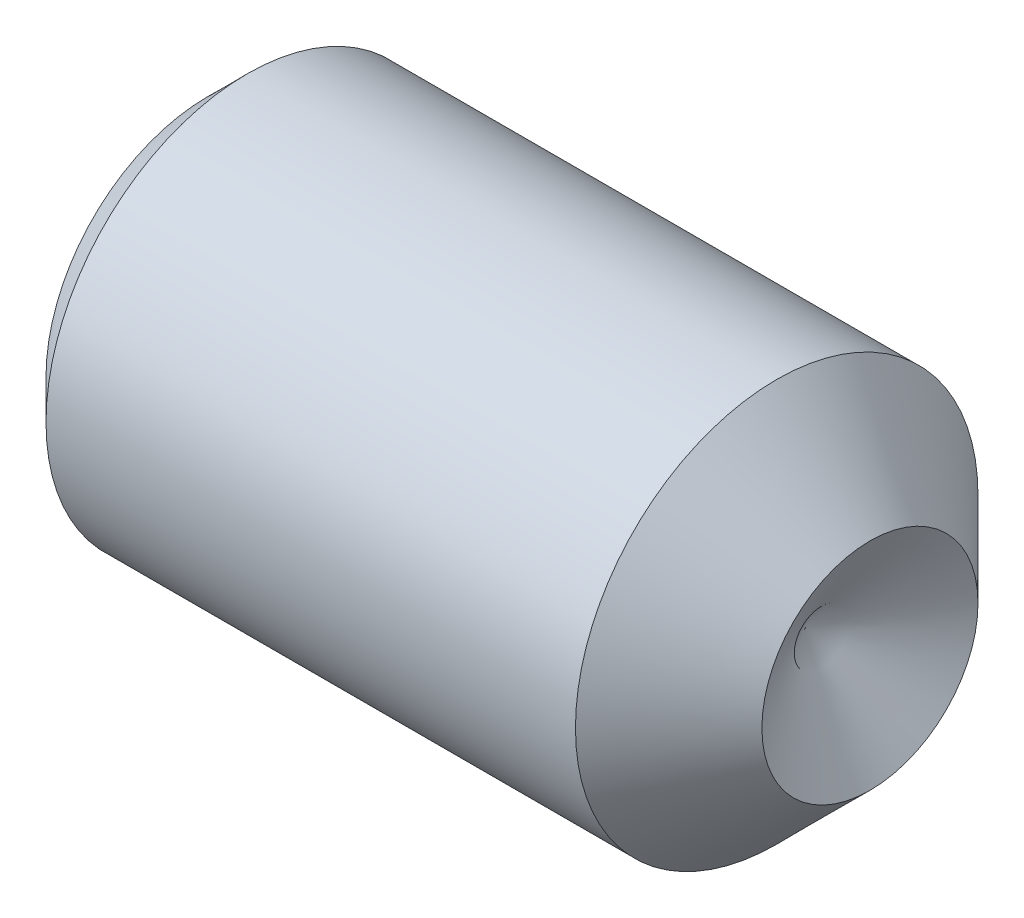
ISO-10303-21;
HEADER;
FILE_DESCRIPTION(('STEP AP214'),'2;1');
FILE_NAME('part.step','',(''),(''),'','','');
FILE_SCHEMA(('AUTOMOTIVE_DESIGN { 1 0 10303 214 1 1 1 1 }'));
ENDSEC;
DATA;
#1=APPLICATION_CONTEXT('core data for automotive mechanical design processes');
#2=APPLICATION_PROTOCOL_DEFINITION('international standard','automotive_design',2000,#1);
#3=PRODUCT_CONTEXT('',#1,'mechanical');
#4=PRODUCT('Part','Part','',(#3));
#5=PRODUCT_RELATED_PRODUCT_CATEGORY('part','',(#4));
#6=PRODUCT_DEFINITION_FORMATION('','',#4);
#7=PRODUCT_DEFINITION_CONTEXT('part definition',#1,'design');
#8=PRODUCT_DEFINITION('design','',#6,#7);
#9=PRODUCT_DEFINITION_SHAPE('','',#8);
#10=(LENGTH_UNIT() NAMED_UNIT(*) SI_UNIT(.MILLI.,.METRE.));
#11=(NAMED_UNIT(*) PLANE_ANGLE_UNIT() SI_UNIT($,.RADIAN.));
#12=(NAMED_UNIT(*) SI_UNIT($,.STERADIAN.) SOLID_ANGLE_UNIT());
#13=UNCERTAINTY_MEASURE_WITH_UNIT(LENGTH_MEASURE(1.E-05),#10,'distance_accuracy_value','');
#14=(GEOMETRIC_REPRESENTATION_CONTEXT(3) GLOBAL_UNCERTAINTY_ASSIGNED_CONTEXT((#13)) GLOBAL_UNIT_ASSIGNED_CONTEXT((#10,
#11,#12)) REPRESENTATION_CONTEXT('',''));
#15=CARTESIAN_POINT('',(0.,0.,0.));
#16=DIRECTION('',(0.,0.,1.));
#17=DIRECTION('',(1.,0.,0.));
#18=AXIS2_PLACEMENT_3D('',#15,#16,#17);
#19=CARTESIAN_POINT('',(0.,0.,0.));
#20=DIRECTION('',(-1.,0.,0.));
#21=DIRECTION('',(0.,0.,1.));
#22=AXIS2_PLACEMENT_3D('',#19,#20,#21);
#23=PLANE('',#22);
#24=CARTESIAN_POINT('',(0.,0.,0.));
#25=DIRECTION('',(-1.,0.,0.));
#26=DIRECTION('',(0.,0.,1.));
#27=AXIS2_PLACEMENT_3D('',#24,#25,#26);
#28=CIRCLE('',#27,1.94056);
#29=CARTESIAN_POINT('',(0.,0.,1.94056));
#30=VERTEX_POINT('',#29);
#31=EDGE_CURVE('E11',#30,#30,#28,.T.);
#32=ORIENTED_EDGE('',*,*,#31,.T.);
#33=EDGE_LOOP('',(#32));
#34=FACE_BOUND('',#33,.T.);
#35=DIRECTION('',(0.,0.,-1.));
#36=VECTOR('',#35,1.);
#37=CARTESIAN_POINT('',(0.,1.18999,0.687041046832963));
#38=LINE('',#37,#36);
#39=CARTESIAN_POINT('',(0.,1.18999,0.687041046832963));
#40=VERTEX_POINT('',#39);
#41=CARTESIAN_POINT('',(0.,1.18999,-0.687041046832962));
#42=VERTEX_POINT('',#41);
#43=EDGE_CURVE('E95',#40,#42,#38,.T.);
#44=ORIENTED_EDGE('',*,*,#43,.F.);
#45=DIRECTION('',(0.,-0.866025403784438,0.5));
#46=VECTOR('',#45,1.);
#47=CARTESIAN_POINT('',(0.,1.18999,0.687041046832963));
#48=LINE('',#47,#46);
#49=CARTESIAN_POINT('',(0.,0.,1.37408209366593));
#50=VERTEX_POINT('',#49);
#51=EDGE_CURVE('E48',#40,#50,#48,.T.);
#52=ORIENTED_EDGE('',*,*,#51,.T.);
#53=DIRECTION('',(0.,0.866025403784439,0.5));
#54=VECTOR('',#53,1.);
#55=CARTESIAN_POINT('',(0.,-1.18999,0.687041046832963));
#56=LINE('',#55,#54);
#57=CARTESIAN_POINT('',(0.,-1.18999,0.687041046832963));
#58=VERTEX_POINT('',#57);
#59=EDGE_CURVE('E101',#58,#50,#56,.T.);
#60=ORIENTED_EDGE('',*,*,#59,.F.);
#61=DIRECTION('',(0.,0.,-1.));
#62=VECTOR('',#61,1.);
#63=CARTESIAN_POINT('',(0.,-1.18999,0.687041046832963));
#64=LINE('',#63,#62);
#65=CARTESIAN_POINT('',(0.,-1.18999,-0.687041046832962));
#66=VERTEX_POINT('',#65);
#67=EDGE_CURVE('E121',#58,#66,#64,.T.);
#68=ORIENTED_EDGE('',*,*,#67,.T.);
#69=DIRECTION('',(0.,0.866025403784438,-0.5));
#70=VECTOR('',#69,1.);
#71=CARTESIAN_POINT('',(0.,-1.18999,-0.687041046832962));
#72=LINE('',#71,#70);
#73=CARTESIAN_POINT('',(0.,0.,-1.37408209366593));
#74=VERTEX_POINT('',#73);
#75=EDGE_CURVE('E124',#66,#74,#72,.T.);
#76=ORIENTED_EDGE('',*,*,#75,.T.);
#77=DIRECTION('',(0.,-0.866025403784438,-0.5));
#78=VECTOR('',#77,1.);
#79=CARTESIAN_POINT('',(0.,1.18999,-0.687041046832962));
#80=LINE('',#79,#78);
#81=EDGE_CURVE('E127',#42,#74,#80,.T.);
#82=ORIENTED_EDGE('',*,*,#81,.F.);
#83=EDGE_LOOP('',(#44,#52,#60,#68,#76,#82));
#84=FACE_BOUND('',#83,.T.);
#85=ADVANCED_FACE('F34',(#34,#84),#23,.T.);
#86=CARTESIAN_POINT('',(0.,0.,0.));
#87=DIRECTION('',(1.,0.,0.));
#88=DIRECTION('',(0.,0.,-1.));
#89=AXIS2_PLACEMENT_3D('',#86,#87,#88);
#90=CONICAL_SURFACE('',#89,1.94056,0.785398163397452);
#91=CARTESIAN_POINT('',(0.472439999999998,0.,0.));
#92=DIRECTION('',(-1.,0.,0.));
#93=DIRECTION('',(0.,0.,1.));
#94=AXIS2_PLACEMENT_3D('',#91,#92,#93);
#95=CIRCLE('',#94,2.413);
#96=CARTESIAN_POINT('',(0.472439999999998,0.,2.413));
#97=VERTEX_POINT('',#96);
#98=EDGE_CURVE('E41',#97,#97,#95,.T.);
#99=ORIENTED_EDGE('',*,*,#98,.T.);
#100=EDGE_LOOP('',(#99));
#101=FACE_BOUND('',#100,.T.);
#102=ORIENTED_EDGE('',*,*,#31,.F.);
#103=EDGE_LOOP('',(#102));
#104=FACE_BOUND('',#103,.T.);
#105=ADVANCED_FACE('F147',(#101,#104),#90,.T.);
#106=CARTESIAN_POINT('',(-12.7,0.,0.));
#107=DIRECTION('',(-1.,0.,0.));
#108=DIRECTION('',(0.,0.,1.));
#109=AXIS2_PLACEMENT_3D('',#106,#107,#108);
#110=CYLINDRICAL_SURFACE('',#109,2.413);
#111=CARTESIAN_POINT('',(6.81990000000001,0.,0.));
#112=DIRECTION('',(-1.,0.,0.));
#113=DIRECTION('',(0.,0.,1.));
#114=AXIS2_PLACEMENT_3D('',#111,#112,#113);
#115=CIRCLE('',#114,2.413);
#116=CARTESIAN_POINT('',(6.81990000000001,0.,2.413));
#117=VERTEX_POINT('',#116);
#118=EDGE_CURVE('E142',#117,#117,#115,.T.);
#119=ORIENTED_EDGE('',*,*,#118,.T.);
#120=EDGE_LOOP('',(#119));
#121=FACE_BOUND('',#120,.T.);
#122=ORIENTED_EDGE('',*,*,#98,.F.);
#123=EDGE_LOOP('',(#122));
#124=FACE_BOUND('',#123,.T.);
#125=ADVANCED_FACE('F150',(#121,#124),#110,.T.);
#126=CARTESIAN_POINT('',(6.81990000000001,0.,0.));
#127=DIRECTION('',(-1.,0.,0.));
#128=DIRECTION('',(0.,0.,1.));
#129=AXIS2_PLACEMENT_3D('',#126,#127,#128);
#130=CONICAL_SURFACE('',#129,2.413,0.785398163397454);
#131=CARTESIAN_POINT('',(7.9375,0.,0.));
#132=DIRECTION('',(-1.,0.,0.));
#133=DIRECTION('',(0.,0.,1.));
#134=AXIS2_PLACEMENT_3D('',#131,#132,#133);
#135=CIRCLE('',#134,1.2954);
#136=CARTESIAN_POINT('',(7.9375,0.,1.2954));
#137=VERTEX_POINT('',#136);
#138=EDGE_CURVE('E102',#137,#137,#135,.T.);
#139=ORIENTED_EDGE('',*,*,#138,.T.);
#140=EDGE_LOOP('',(#139));
#141=FACE_BOUND('',#140,.T.);
#142=ORIENTED_EDGE('',*,*,#118,.F.);
#143=EDGE_LOOP('',(#142));
#144=FACE_BOUND('',#143,.T.);
#145=ADVANCED_FACE('F152',(#141,#144),#130,.T.);
#146=CARTESIAN_POINT('',(7.1591451541117,0.,0.));
#147=DIRECTION('',(1.,0.,0.));
#148=DIRECTION('',(0.,0.,-1.));
#149=AXIS2_PLACEMENT_3D('',#146,#147,#148);
#150=CONICAL_SURFACE('',#149,0.,1.02974425867666);
#151=ORIENTED_EDGE('',*,*,#138,.F.);
#152=EDGE_LOOP('',(#151));
#153=FACE_BOUND('',#152,.T.);
#154=CARTESIAN_POINT('',(7.1591451541117,0.,0.));
#155=VERTEX_POINT('',#154);
#156=VERTEX_LOOP('',#155);
#157=FACE_BOUND('',#156,.T.);
#158=ADVANCED_FACE('F159',(#153,#157),#150,.F.);
#159=CARTESIAN_POINT('',(2.54,1.18999,0.687041046832963));
#160=DIRECTION('',(0.,-0.5,-0.866025403784439));
#161=DIRECTION('',(0.,0.866025403784438,-0.5));
#162=AXIS2_PLACEMENT_3D('',#159,#160,#161);
#163=PLANE('',#162);
#164=ORIENTED_EDGE('',*,*,#51,.F.);
#165=DIRECTION('',(-1.,0.,0.));
#166=VECTOR('',#165,1.);
#167=CARTESIAN_POINT('',(2.54,1.18999,0.687041046832963));
#168=LINE('',#167,#166);
#169=CARTESIAN_POINT('',(2.54,1.18999,0.687041046832963));
#170=VERTEX_POINT('',#169);
#171=EDGE_CURVE('E89',#170,#40,#168,.T.);
#172=ORIENTED_EDGE('',*,*,#171,.F.);
#173=DIRECTION('',(0.,-0.866025403784438,0.5));
#174=VECTOR('',#173,1.);
#175=CARTESIAN_POINT('',(2.54,1.18999,0.687041046832963));
#176=LINE('',#175,#174);
#177=CARTESIAN_POINT('',(2.54,0.,1.37408209366593));
#178=VERTEX_POINT('',#177);
#179=EDGE_CURVE('E84',#170,#178,#176,.T.);
#180=ORIENTED_EDGE('',*,*,#179,.T.);
#181=DIRECTION('',(-1.,0.,0.));
#182=VECTOR('',#181,1.);
#183=CARTESIAN_POINT('',(2.54,0.,1.37408209366593));
#184=LINE('',#183,#182);
#185=EDGE_CURVE('E87',#178,#50,#184,.T.);
#186=ORIENTED_EDGE('',*,*,#185,.T.);
#187=EDGE_LOOP('',(#164,#172,#180,#186));
#188=FACE_BOUND('',#187,.T.);
#189=ADVANCED_FACE('F86',(#188),#163,.T.);
#190=CARTESIAN_POINT('',(2.54,-1.18999,0.687041046832963));
#191=DIRECTION('',(0.,-0.5,0.866025403784439));
#192=DIRECTION('',(0.,-0.866025403784439,-0.5));
#193=AXIS2_PLACEMENT_3D('',#190,#191,#192);
#194=PLANE('',#193);
#195=ORIENTED_EDGE('',*,*,#59,.T.);
#196=ORIENTED_EDGE('',*,*,#185,.F.);
#197=DIRECTION('',(0.,0.866025403784439,0.5));
#198=VECTOR('',#197,1.);
#199=CARTESIAN_POINT('',(2.54,-1.18999,0.687041046832963));
#200=LINE('',#199,#198);
#201=CARTESIAN_POINT('',(2.54,-1.18999,0.687041046832963));
#202=VERTEX_POINT('',#201);
#203=EDGE_CURVE('E94',#202,#178,#200,.T.);
#204=ORIENTED_EDGE('',*,*,#203,.F.);
#205=DIRECTION('',(-1.,0.,0.));
#206=VECTOR('',#205,1.);
#207=CARTESIAN_POINT('',(2.54,-1.18999,0.687041046832963));
#208=LINE('',#207,#206);
#209=EDGE_CURVE('E103',#202,#58,#208,.T.);
#210=ORIENTED_EDGE('',*,*,#209,.T.);
#211=EDGE_LOOP('',(#195,#196,#204,#210));
#212=FACE_BOUND('',#211,.T.);
#213=ADVANCED_FACE('F99',(#212),#194,.F.);
#214=CARTESIAN_POINT('',(2.54,-1.18999,0.687041046832963));
#215=DIRECTION('',(0.,1.,0.));
#216=DIRECTION('',(0.,0.,1.));
#217=AXIS2_PLACEMENT_3D('',#214,#215,#216);
#218=PLANE('',#217);
#219=ORIENTED_EDGE('',*,*,#67,.F.);
#220=ORIENTED_EDGE('',*,*,#209,.F.);
#221=DIRECTION('',(0.,0.,-1.));
#222=VECTOR('',#221,1.);
#223=CARTESIAN_POINT('',(2.54,-1.18999,0.687041046832963));
#224=LINE('',#223,#222);
#225=CARTESIAN_POINT('',(2.54,-1.18999,-0.687041046832962));
#226=VERTEX_POINT('',#225);
#227=EDGE_CURVE('E108',#202,#226,#224,.T.);
#228=ORIENTED_EDGE('',*,*,#227,.T.);
#229=DIRECTION('',(-1.,0.,0.));
#230=VECTOR('',#229,1.);
#231=CARTESIAN_POINT('',(2.54,-1.18999,-0.687041046832962));
#232=LINE('',#231,#230);
#233=EDGE_CURVE('E137',#226,#66,#232,.T.);
#234=ORIENTED_EDGE('',*,*,#233,.T.);
#235=EDGE_LOOP('',(#219,#220,#228,#234));
#236=FACE_BOUND('',#235,.T.);
#237=ADVANCED_FACE('F182',(#236),#218,.T.);
#238=CARTESIAN_POINT('',(2.54,-1.18999,-0.687041046832962));
#239=DIRECTION('',(0.,0.5,0.866025403784439));
#240=DIRECTION('',(0.,-0.866025403784438,0.5));
#241=AXIS2_PLACEMENT_3D('',#238,#239,#240);
#242=PLANE('',#241);
#243=ORIENTED_EDGE('',*,*,#75,.F.);
#244=ORIENTED_EDGE('',*,*,#233,.F.);
#245=DIRECTION('',(0.,0.866025403784438,-0.5));
#246=VECTOR('',#245,1.);
#247=CARTESIAN_POINT('',(2.54,-1.18999,-0.687041046832962));
#248=LINE('',#247,#246);
#249=CARTESIAN_POINT('',(2.54,0.,-1.37408209366593));
#250=VERTEX_POINT('',#249);
#251=EDGE_CURVE('E110',#226,#250,#248,.T.);
#252=ORIENTED_EDGE('',*,*,#251,.T.);
#253=DIRECTION('',(-1.,0.,0.));
#254=VECTOR('',#253,1.);
#255=CARTESIAN_POINT('',(2.54,0.,-1.37408209366593));
#256=LINE('',#255,#254);
#257=EDGE_CURVE('E135',#250,#74,#256,.T.);
#258=ORIENTED_EDGE('',*,*,#257,.T.);
#259=EDGE_LOOP('',(#243,#244,#252,#258));
#260=FACE_BOUND('',#259,.T.);
#261=ADVANCED_FACE('F178',(#260),#242,.T.);
#262=CARTESIAN_POINT('',(2.54,1.18999,-0.687041046832962));
#263=DIRECTION('',(0.,0.5,-0.866025403784438));
#264=DIRECTION('',(0.,0.866025403784438,0.5));
#265=AXIS2_PLACEMENT_3D('',#262,#263,#264);
#266=PLANE('',#265);
#267=ORIENTED_EDGE('',*,*,#81,.T.);
#268=ORIENTED_EDGE('',*,*,#257,.F.);
#269=DIRECTION('',(0.,-0.866025403784438,-0.5));
#270=VECTOR('',#269,1.);
#271=CARTESIAN_POINT('',(2.54,1.18999,-0.687041046832962));
#272=LINE('',#271,#270);
#273=CARTESIAN_POINT('',(2.54,1.18999,-0.687041046832962));
#274=VERTEX_POINT('',#273);
#275=EDGE_CURVE('E114',#274,#250,#272,.T.);
#276=ORIENTED_EDGE('',*,*,#275,.F.);
#277=DIRECTION('',(-1.,0.,0.));
#278=VECTOR('',#277,1.);
#279=CARTESIAN_POINT('',(2.54,1.18999,-0.687041046832962));
#280=LINE('',#279,#278);
#281=EDGE_CURVE('E133',#274,#42,#280,.T.);
#282=ORIENTED_EDGE('',*,*,#281,.T.);
#283=EDGE_LOOP('',(#267,#268,#276,#282));
#284=FACE_BOUND('',#283,.T.);
#285=ADVANCED_FACE('F175',(#284),#266,.F.);
#286=CARTESIAN_POINT('',(2.54,1.18999,0.687041046832963));
#287=DIRECTION('',(0.,1.,0.));
#288=DIRECTION('',(0.,0.,1.));
#289=AXIS2_PLACEMENT_3D('',#286,#287,#288);
#290=PLANE('',#289);
#291=ORIENTED_EDGE('',*,*,#43,.T.);
#292=ORIENTED_EDGE('',*,*,#281,.F.);
#293=DIRECTION('',(0.,0.,-1.));
#294=VECTOR('',#293,1.);
#295=CARTESIAN_POINT('',(2.54,1.18999,0.687041046832963));
#296=LINE('',#295,#294);
#297=EDGE_CURVE('E117',#170,#274,#296,.T.);
#298=ORIENTED_EDGE('',*,*,#297,.F.);
#299=ORIENTED_EDGE('',*,*,#171,.T.);
#300=EDGE_LOOP('',(#291,#292,#298,#299));
#301=FACE_BOUND('',#300,.T.);
#302=ADVANCED_FACE('F171',(#301),#290,.F.);
#303=CARTESIAN_POINT('',(2.54,2.37998,0.));
#304=DIRECTION('',(1.,0.,0.));
#305=DIRECTION('',(0.,0.,-1.));
#306=AXIS2_PLACEMENT_3D('',#303,#304,#305);
#307=PLANE('',#306);
#308=ORIENTED_EDGE('',*,*,#179,.F.);
#309=ORIENTED_EDGE('',*,*,#297,.T.);
#310=ORIENTED_EDGE('',*,*,#275,.T.);
#311=ORIENTED_EDGE('',*,*,#251,.F.);
#312=ORIENTED_EDGE('',*,*,#227,.F.);
#313=ORIENTED_EDGE('',*,*,#203,.T.);
#314=EDGE_LOOP('',(#308,#309,#310,#311,#312,#313));
#315=FACE_BOUND('',#314,.T.);
#316=ADVANCED_FACE('F106',(#315),#307,.F.);
#317=CLOSED_SHELL('',(#85,#105,#125,#145,#158,#189,#213,#237,#261,#285,#302,#316));
#318=MANIFOLD_SOLID_BREP('B2',#317);
#319=ADVANCED_BREP_SHAPE_REPRESENTATION('',(#18,#318),#14);
#320=SHAPE_DEFINITION_REPRESENTATION(#9,#319);
ENDSEC;
END-ISO-10303-21;
